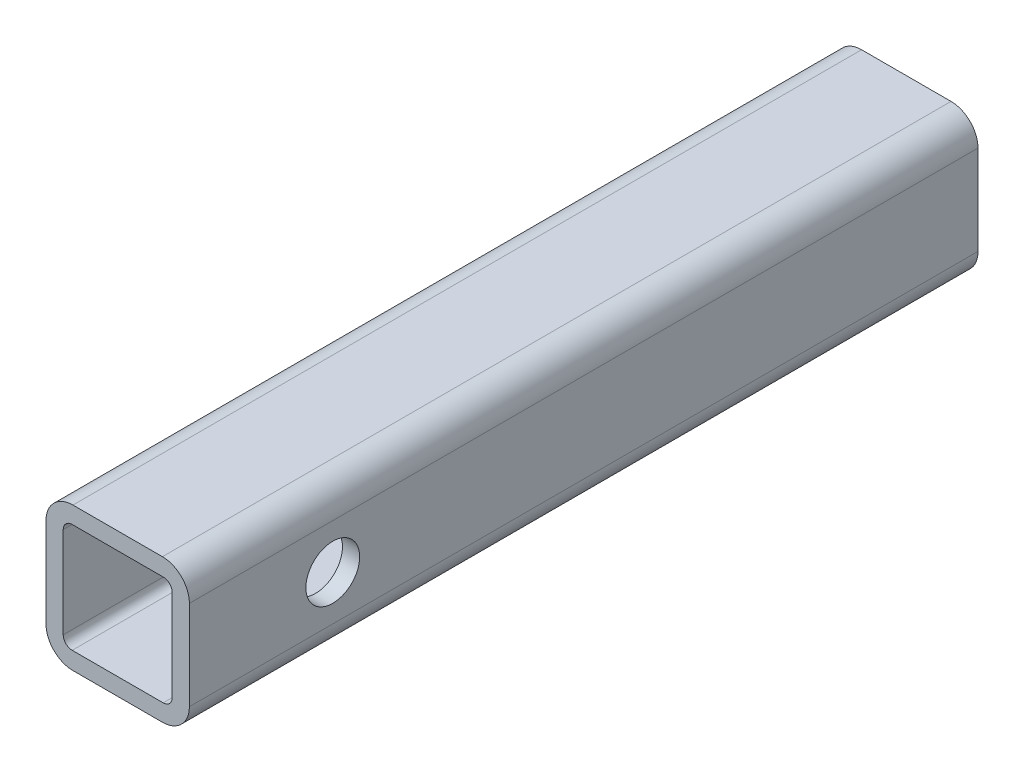
ISO-10303-21;
HEADER;
FILE_DESCRIPTION(('STEP AP214'),'2;1');
FILE_NAME('part.step','',(''),(''),'','','');
FILE_SCHEMA(('AUTOMOTIVE_DESIGN { 1 0 10303 214 1 1 1 1 }'));
ENDSEC;
DATA;
#1=APPLICATION_CONTEXT('core data for automotive mechanical design processes');
#2=APPLICATION_PROTOCOL_DEFINITION('international standard','automotive_design',2000,#1);
#3=PRODUCT_CONTEXT('',#1,'mechanical');
#4=PRODUCT('Part','Part','',(#3));
#5=PRODUCT_RELATED_PRODUCT_CATEGORY('part','',(#4));
#6=PRODUCT_DEFINITION_FORMATION('','',#4);
#7=PRODUCT_DEFINITION_CONTEXT('part definition',#1,'design');
#8=PRODUCT_DEFINITION('design','',#6,#7);
#9=PRODUCT_DEFINITION_SHAPE('','',#8);
#10=(LENGTH_UNIT() NAMED_UNIT(*) SI_UNIT(.MILLI.,.METRE.));
#11=(NAMED_UNIT(*) PLANE_ANGLE_UNIT() SI_UNIT($,.RADIAN.));
#12=(NAMED_UNIT(*) SI_UNIT($,.STERADIAN.) SOLID_ANGLE_UNIT());
#13=UNCERTAINTY_MEASURE_WITH_UNIT(LENGTH_MEASURE(1.E-05),#10,'distance_accuracy_value','');
#14=(GEOMETRIC_REPRESENTATION_CONTEXT(3) GLOBAL_UNCERTAINTY_ASSIGNED_CONTEXT((#13)) GLOBAL_UNIT_ASSIGNED_CONTEXT((#10,
#11,#12)) REPRESENTATION_CONTEXT('',''));
#15=CARTESIAN_POINT('',(0.,0.,0.));
#16=DIRECTION('',(0.,0.,1.));
#17=DIRECTION('',(1.,0.,0.));
#18=AXIS2_PLACEMENT_3D('',#15,#16,#17);
#19=CARTESIAN_POINT('',(25.4,12.7,114.3));
#20=DIRECTION('',(1.,0.,0.));
#21=DIRECTION('',(0.,0.,-1.));
#22=AXIS2_PLACEMENT_3D('',#19,#20,#21);
#23=CYLINDRICAL_SURFACE('',#22,4.7625);
#24=CARTESIAN_POINT('',(3.048,12.7,114.3));
#25=DIRECTION('',(1.,0.,0.));
#26=DIRECTION('',(0.,0.,-1.));
#27=AXIS2_PLACEMENT_3D('',#24,#25,#26);
#28=CIRCLE('',#27,4.7625);
#29=CARTESIAN_POINT('',(3.048,12.7,109.5375));
#30=VERTEX_POINT('',#29);
#31=EDGE_CURVE('E177',#30,#30,#28,.F.);
#32=ORIENTED_EDGE('',*,*,#31,.F.);
#33=EDGE_LOOP('',(#32));
#34=FACE_BOUND('',#33,.T.);
#35=CARTESIAN_POINT('',(0.,12.7,114.3));
#36=DIRECTION('',(1.,0.,0.));
#37=DIRECTION('',(0.,0.,-1.));
#38=AXIS2_PLACEMENT_3D('',#35,#36,#37);
#39=CIRCLE('',#38,4.7625);
#40=CARTESIAN_POINT('',(0.,12.7,109.5375));
#41=VERTEX_POINT('',#40);
#42=EDGE_CURVE('E19',#41,#41,#39,.T.);
#43=ORIENTED_EDGE('',*,*,#42,.F.);
#44=EDGE_LOOP('',(#43));
#45=FACE_BOUND('',#44,.T.);
#46=ADVANCED_FACE('F16',(#34,#45),#23,.F.);
#47=CARTESIAN_POINT('',(25.4,12.7,114.3));
#48=DIRECTION('',(1.,0.,0.));
#49=DIRECTION('',(0.,0.,-1.));
#50=AXIS2_PLACEMENT_3D('',#47,#48,#49);
#51=CYLINDRICAL_SURFACE('',#50,4.7625);
#52=CARTESIAN_POINT('',(22.352,12.7,114.3));
#53=DIRECTION('',(1.,0.,0.));
#54=DIRECTION('',(0.,0.,-1.));
#55=AXIS2_PLACEMENT_3D('',#52,#53,#54);
#56=CIRCLE('',#55,4.7625);
#57=CARTESIAN_POINT('',(22.352,12.7,109.5375));
#58=VERTEX_POINT('',#57);
#59=EDGE_CURVE('E167',#58,#58,#56,.T.);
#60=ORIENTED_EDGE('',*,*,#59,.F.);
#61=EDGE_LOOP('',(#60));
#62=FACE_BOUND('',#61,.T.);
#63=CARTESIAN_POINT('',(25.4,12.7,114.3));
#64=DIRECTION('',(1.,0.,0.));
#65=DIRECTION('',(0.,0.,-1.));
#66=AXIS2_PLACEMENT_3D('',#63,#64,#65);
#67=CIRCLE('',#66,4.7625);
#68=CARTESIAN_POINT('',(25.4,12.7,109.5375));
#69=VERTEX_POINT('',#68);
#70=EDGE_CURVE('E184',#69,#69,#67,.F.);
#71=ORIENTED_EDGE('',*,*,#70,.F.);
#72=EDGE_LOOP('',(#71));
#73=FACE_BOUND('',#72,.T.);
#74=ADVANCED_FACE('F245',(#62,#73),#51,.F.);
#75=CARTESIAN_POINT('',(4.7752,20.6248,321.81292));
#76=DIRECTION('',(0.,0.,-1.));
#77=DIRECTION('',(-1.,0.,0.));
#78=AXIS2_PLACEMENT_3D('',#75,#76,#77);
#79=CYLINDRICAL_SURFACE('',#78,4.7752);
#80=CARTESIAN_POINT('',(4.7752,20.6248,139.7));
#81=DIRECTION('',(0.,0.,-1.));
#82=DIRECTION('',(-1.,0.,0.));
#83=AXIS2_PLACEMENT_3D('',#80,#81,#82);
#84=CIRCLE('',#83,4.7752);
#85=CARTESIAN_POINT('',(4.7752,25.4,139.7));
#86=VERTEX_POINT('',#85);
#87=CARTESIAN_POINT('',(0.,20.6248,139.7));
#88=VERTEX_POINT('',#87);
#89=EDGE_CURVE('E171',#86,#88,#84,.F.);
#90=ORIENTED_EDGE('',*,*,#89,.F.);
#91=DIRECTION('',(0.,0.,1.));
#92=VECTOR('',#91,1.);
#93=CARTESIAN_POINT('',(4.7752,25.4,0.));
#94=LINE('',#93,#92);
#95=CARTESIAN_POINT('',(4.7752,25.4,0.));
#96=VERTEX_POINT('',#95);
#97=EDGE_CURVE('E178',#96,#86,#94,.T.);
#98=ORIENTED_EDGE('',*,*,#97,.F.);
#99=CARTESIAN_POINT('',(4.7752,20.6248,0.));
#100=DIRECTION('',(0.,0.,-1.));
#101=DIRECTION('',(-1.,0.,0.));
#102=AXIS2_PLACEMENT_3D('',#99,#100,#101);
#103=CIRCLE('',#102,4.7752);
#104=CARTESIAN_POINT('',(0.,20.6248,0.));
#105=VERTEX_POINT('',#104);
#106=EDGE_CURVE('E230',#96,#105,#103,.F.);
#107=ORIENTED_EDGE('',*,*,#106,.T.);
#108=DIRECTION('',(0.,0.,1.));
#109=VECTOR('',#108,1.);
#110=CARTESIAN_POINT('',(0.,20.6248,0.));
#111=LINE('',#110,#109);
#112=EDGE_CURVE('E190',#88,#105,#111,.F.);
#113=ORIENTED_EDGE('',*,*,#112,.F.);
#114=EDGE_LOOP('',(#90,#98,#107,#113));
#115=FACE_BOUND('',#114,.T.);
#116=ADVANCED_FACE('F247',(#115),#79,.T.);
#117=CARTESIAN_POINT('',(0.,25.4,0.));
#118=DIRECTION('',(-1.,0.,0.));
#119=DIRECTION('',(0.,0.,1.));
#120=AXIS2_PLACEMENT_3D('',#117,#118,#119);
#121=PLANE('',#120);
#122=ORIENTED_EDGE('',*,*,#42,.T.);
#123=EDGE_LOOP('',(#122));
#124=FACE_BOUND('',#123,.T.);
#125=DIRECTION('',(0.,0.,-1.));
#126=VECTOR('',#125,1.);
#127=CARTESIAN_POINT('',(0.,4.7752,321.81292));
#128=LINE('',#127,#126);
#129=CARTESIAN_POINT('',(0.,4.7752,139.7));
#130=VERTEX_POINT('',#129);
#131=CARTESIAN_POINT('',(0.,4.7752,0.));
#132=VERTEX_POINT('',#131);
#133=EDGE_CURVE('E130',#130,#132,#128,.T.);
#134=ORIENTED_EDGE('',*,*,#133,.F.);
#135=DIRECTION('',(0.,1.,0.));
#136=VECTOR('',#135,1.);
#137=CARTESIAN_POINT('',(0.,0.,139.7));
#138=LINE('',#137,#136);
#139=EDGE_CURVE('E216',#88,#130,#138,.F.);
#140=ORIENTED_EDGE('',*,*,#139,.F.);
#141=ORIENTED_EDGE('',*,*,#112,.T.);
#142=DIRECTION('',(0.,1.,0.));
#143=VECTOR('',#142,1.);
#144=CARTESIAN_POINT('',(0.,0.,0.));
#145=LINE('',#144,#143);
#146=EDGE_CURVE('E119',#105,#132,#145,.F.);
#147=ORIENTED_EDGE('',*,*,#146,.T.);
#148=EDGE_LOOP('',(#134,#140,#141,#147));
#149=FACE_BOUND('',#148,.T.);
#150=ADVANCED_FACE('F254',(#124,#149),#121,.T.);
#151=CARTESIAN_POINT('',(4.7752,4.7752,321.81292));
#152=DIRECTION('',(0.,0.,-1.));
#153=DIRECTION('',(-1.,0.,0.));
#154=AXIS2_PLACEMENT_3D('',#151,#152,#153);
#155=CYLINDRICAL_SURFACE('',#154,4.7752);
#156=CARTESIAN_POINT('',(4.7752,4.7752,139.7));
#157=DIRECTION('',(0.,0.,-1.));
#158=DIRECTION('',(-1.,0.,0.));
#159=AXIS2_PLACEMENT_3D('',#156,#157,#158);
#160=CIRCLE('',#159,4.7752);
#161=CARTESIAN_POINT('',(4.7752,0.,139.7));
#162=VERTEX_POINT('',#161);
#163=EDGE_CURVE('E214',#130,#162,#160,.F.);
#164=ORIENTED_EDGE('',*,*,#163,.F.);
#165=ORIENTED_EDGE('',*,*,#133,.T.);
#166=CARTESIAN_POINT('',(4.7752,4.7752,0.));
#167=DIRECTION('',(0.,0.,-1.));
#168=DIRECTION('',(-1.,0.,0.));
#169=AXIS2_PLACEMENT_3D('',#166,#167,#168);
#170=CIRCLE('',#169,4.7752);
#171=CARTESIAN_POINT('',(4.7752,0.,0.));
#172=VERTEX_POINT('',#171);
#173=EDGE_CURVE('E124',#132,#172,#170,.F.);
#174=ORIENTED_EDGE('',*,*,#173,.T.);
#175=DIRECTION('',(0.,0.,-1.));
#176=VECTOR('',#175,1.);
#177=CARTESIAN_POINT('',(4.7752,0.,0.));
#178=LINE('',#177,#176);
#179=EDGE_CURVE('E128',#162,#172,#178,.T.);
#180=ORIENTED_EDGE('',*,*,#179,.F.);
#181=EDGE_LOOP('',(#164,#165,#174,#180));
#182=FACE_BOUND('',#181,.T.);
#183=ADVANCED_FACE('F127',(#182),#155,.T.);
#184=CARTESIAN_POINT('',(0.,0.,0.));
#185=DIRECTION('',(0.,-1.,0.));
#186=DIRECTION('',(0.,0.,-1.));
#187=AXIS2_PLACEMENT_3D('',#184,#185,#186);
#188=PLANE('',#187);
#189=DIRECTION('',(0.,0.,-1.));
#190=VECTOR('',#189,1.);
#191=CARTESIAN_POINT('',(20.6248,0.,321.81292));
#192=LINE('',#191,#190);
#193=CARTESIAN_POINT('',(20.6248,0.,139.7));
#194=VERTEX_POINT('',#193);
#195=CARTESIAN_POINT('',(20.6248,0.,0.));
#196=VERTEX_POINT('',#195);
#197=EDGE_CURVE('E141',#194,#196,#192,.T.);
#198=ORIENTED_EDGE('',*,*,#197,.F.);
#199=DIRECTION('',(1.,0.,0.));
#200=VECTOR('',#199,1.);
#201=CARTESIAN_POINT('',(0.,0.,139.7));
#202=LINE('',#201,#200);
#203=EDGE_CURVE('E139',#162,#194,#202,.T.);
#204=ORIENTED_EDGE('',*,*,#203,.F.);
#205=ORIENTED_EDGE('',*,*,#179,.T.);
#206=DIRECTION('',(1.,0.,0.));
#207=VECTOR('',#206,1.);
#208=CARTESIAN_POINT('',(0.,0.,0.));
#209=LINE('',#208,#207);
#210=EDGE_CURVE('E133',#172,#196,#209,.T.);
#211=ORIENTED_EDGE('',*,*,#210,.T.);
#212=EDGE_LOOP('',(#198,#204,#205,#211));
#213=FACE_BOUND('',#212,.T.);
#214=ADVANCED_FACE('F136',(#213),#188,.T.);
#215=CARTESIAN_POINT('',(20.6248,4.7752,321.81292));
#216=DIRECTION('',(0.,0.,-1.));
#217=DIRECTION('',(-1.,0.,0.));
#218=AXIS2_PLACEMENT_3D('',#215,#216,#217);
#219=CYLINDRICAL_SURFACE('',#218,4.7752);
#220=CARTESIAN_POINT('',(20.6248,4.7752,139.7));
#221=DIRECTION('',(0.,0.,-1.));
#222=DIRECTION('',(-1.,0.,0.));
#223=AXIS2_PLACEMENT_3D('',#220,#221,#222);
#224=CIRCLE('',#223,4.7752);
#225=CARTESIAN_POINT('',(25.4,4.7752,139.7));
#226=VERTEX_POINT('',#225);
#227=EDGE_CURVE('E211',#194,#226,#224,.F.);
#228=ORIENTED_EDGE('',*,*,#227,.F.);
#229=ORIENTED_EDGE('',*,*,#197,.T.);
#230=CARTESIAN_POINT('',(20.6248,4.7752,0.));
#231=DIRECTION('',(0.,0.,-1.));
#232=DIRECTION('',(-1.,0.,0.));
#233=AXIS2_PLACEMENT_3D('',#230,#231,#232);
#234=CIRCLE('',#233,4.7752);
#235=CARTESIAN_POINT('',(25.4,4.7752,0.));
#236=VERTEX_POINT('',#235);
#237=EDGE_CURVE('E147',#196,#236,#234,.F.);
#238=ORIENTED_EDGE('',*,*,#237,.T.);
#239=DIRECTION('',(0.,0.,-1.));
#240=VECTOR('',#239,1.);
#241=CARTESIAN_POINT('',(25.4,4.7752,0.));
#242=LINE('',#241,#240);
#243=EDGE_CURVE('E185',#226,#236,#242,.T.);
#244=ORIENTED_EDGE('',*,*,#243,.F.);
#245=EDGE_LOOP('',(#228,#229,#238,#244));
#246=FACE_BOUND('',#245,.T.);
#247=ADVANCED_FACE('F311',(#246),#219,.T.);
#248=CARTESIAN_POINT('',(25.4,0.,0.));
#249=DIRECTION('',(1.,0.,0.));
#250=DIRECTION('',(0.,0.,-1.));
#251=AXIS2_PLACEMENT_3D('',#248,#249,#250);
#252=PLANE('',#251);
#253=ORIENTED_EDGE('',*,*,#70,.T.);
#254=EDGE_LOOP('',(#253));
#255=FACE_BOUND('',#254,.T.);
#256=DIRECTION('',(0.,0.,-1.));
#257=VECTOR('',#256,1.);
#258=CARTESIAN_POINT('',(25.4,20.6248,321.81292));
#259=LINE('',#258,#257);
#260=CARTESIAN_POINT('',(25.4,20.6248,139.7));
#261=VERTEX_POINT('',#260);
#262=CARTESIAN_POINT('',(25.4,20.6248,0.));
#263=VERTEX_POINT('',#262);
#264=EDGE_CURVE('E181',#261,#263,#259,.T.);
#265=ORIENTED_EDGE('',*,*,#264,.F.);
#266=DIRECTION('',(0.,1.,0.));
#267=VECTOR('',#266,1.);
#268=CARTESIAN_POINT('',(25.4,0.,139.7));
#269=LINE('',#268,#267);
#270=EDGE_CURVE('E210',#226,#261,#269,.T.);
#271=ORIENTED_EDGE('',*,*,#270,.F.);
#272=ORIENTED_EDGE('',*,*,#243,.T.);
#273=DIRECTION('',(0.,1.,0.));
#274=VECTOR('',#273,1.);
#275=CARTESIAN_POINT('',(25.4,0.,0.));
#276=LINE('',#275,#274);
#277=EDGE_CURVE('E149',#236,#263,#276,.T.);
#278=ORIENTED_EDGE('',*,*,#277,.T.);
#279=EDGE_LOOP('',(#265,#271,#272,#278));
#280=FACE_BOUND('',#279,.T.);
#281=ADVANCED_FACE('F242',(#255,#280),#252,.T.);
#282=CARTESIAN_POINT('',(20.6248,20.6248,321.81292));
#283=DIRECTION('',(0.,0.,-1.));
#284=DIRECTION('',(-1.,0.,0.));
#285=AXIS2_PLACEMENT_3D('',#282,#283,#284);
#286=CYLINDRICAL_SURFACE('',#285,4.7752);
#287=CARTESIAN_POINT('',(20.6248,20.6248,139.7));
#288=DIRECTION('',(0.,0.,-1.));
#289=DIRECTION('',(-1.,0.,0.));
#290=AXIS2_PLACEMENT_3D('',#287,#288,#289);
#291=CIRCLE('',#290,4.7752);
#292=CARTESIAN_POINT('',(20.6248,25.4,139.7));
#293=VERTEX_POINT('',#292);
#294=EDGE_CURVE('E206',#261,#293,#291,.F.);
#295=ORIENTED_EDGE('',*,*,#294,.F.);
#296=ORIENTED_EDGE('',*,*,#264,.T.);
#297=CARTESIAN_POINT('',(20.6248,20.6248,0.));
#298=DIRECTION('',(0.,0.,-1.));
#299=DIRECTION('',(-1.,0.,0.));
#300=AXIS2_PLACEMENT_3D('',#297,#298,#299);
#301=CIRCLE('',#300,4.7752);
#302=CARTESIAN_POINT('',(20.6248,25.4,0.));
#303=VERTEX_POINT('',#302);
#304=EDGE_CURVE('E234',#263,#303,#301,.F.);
#305=ORIENTED_EDGE('',*,*,#304,.T.);
#306=DIRECTION('',(0.,0.,1.));
#307=VECTOR('',#306,1.);
#308=CARTESIAN_POINT('',(20.6248,25.4,0.));
#309=LINE('',#308,#307);
#310=EDGE_CURVE('E174',#293,#303,#309,.F.);
#311=ORIENTED_EDGE('',*,*,#310,.F.);
#312=EDGE_LOOP('',(#295,#296,#305,#311));
#313=FACE_BOUND('',#312,.T.);
#314=ADVANCED_FACE('F304',(#313),#286,.T.);
#315=CARTESIAN_POINT('',(25.4,25.4,0.));
#316=DIRECTION('',(0.,1.,0.));
#317=DIRECTION('',(0.,0.,1.));
#318=AXIS2_PLACEMENT_3D('',#315,#316,#317);
#319=PLANE('',#318);
#320=ORIENTED_EDGE('',*,*,#310,.T.);
#321=DIRECTION('',(1.,0.,0.));
#322=VECTOR('',#321,1.);
#323=CARTESIAN_POINT('',(0.,25.4,0.));
#324=LINE('',#323,#322);
#325=EDGE_CURVE('E233',#303,#96,#324,.F.);
#326=ORIENTED_EDGE('',*,*,#325,.T.);
#327=ORIENTED_EDGE('',*,*,#97,.T.);
#328=DIRECTION('',(1.,0.,0.));
#329=VECTOR('',#328,1.);
#330=CARTESIAN_POINT('',(0.,25.4,139.7));
#331=LINE('',#330,#329);
#332=EDGE_CURVE('E209',#293,#86,#331,.F.);
#333=ORIENTED_EDGE('',*,*,#332,.F.);
#334=EDGE_LOOP('',(#320,#326,#327,#333));
#335=FACE_BOUND('',#334,.T.);
#336=ADVANCED_FACE('F300',(#335),#319,.T.);
#337=CARTESIAN_POINT('',(3.048,3.048,0.));
#338=DIRECTION('',(1.,0.,0.));
#339=DIRECTION('',(0.,0.,-1.));
#340=AXIS2_PLACEMENT_3D('',#337,#338,#339);
#341=PLANE('',#340);
#342=ORIENTED_EDGE('',*,*,#31,.T.);
#343=EDGE_LOOP('',(#342));
#344=FACE_BOUND('',#343,.T.);
#345=DIRECTION('',(0.,0.,1.));
#346=VECTOR('',#345,1.);
#347=CARTESIAN_POINT('',(3.048,4.6355,-182.11292));
#348=LINE('',#347,#346);
#349=CARTESIAN_POINT('',(3.048,4.6355,139.7));
#350=VERTEX_POINT('',#349);
#351=CARTESIAN_POINT('',(3.048,4.6355,0.));
#352=VERTEX_POINT('',#351);
#353=EDGE_CURVE('E159',#350,#352,#348,.F.);
#354=ORIENTED_EDGE('',*,*,#353,.T.);
#355=DIRECTION('',(0.,1.,0.));
#356=VECTOR('',#355,1.);
#357=CARTESIAN_POINT('',(3.048,0.,0.));
#358=LINE('',#357,#356);
#359=CARTESIAN_POINT('',(3.048,20.7645,0.));
#360=VERTEX_POINT('',#359);
#361=EDGE_CURVE('E226',#352,#360,#358,.T.);
#362=ORIENTED_EDGE('',*,*,#361,.T.);
#363=DIRECTION('',(0.,0.,1.));
#364=VECTOR('',#363,1.);
#365=CARTESIAN_POINT('',(3.048,20.7645,-182.11292));
#366=LINE('',#365,#364);
#367=CARTESIAN_POINT('',(3.048,20.7645,139.7));
#368=VERTEX_POINT('',#367);
#369=EDGE_CURVE('E155',#360,#368,#366,.T.);
#370=ORIENTED_EDGE('',*,*,#369,.T.);
#371=DIRECTION('',(0.,1.,0.));
#372=VECTOR('',#371,1.);
#373=CARTESIAN_POINT('',(3.048,0.,139.7));
#374=LINE('',#373,#372);
#375=EDGE_CURVE('E205',#350,#368,#374,.T.);
#376=ORIENTED_EDGE('',*,*,#375,.F.);
#377=EDGE_LOOP('',(#354,#362,#370,#376));
#378=FACE_BOUND('',#377,.T.);
#379=ADVANCED_FACE('F296',(#344,#378),#341,.T.);
#380=CARTESIAN_POINT('',(22.352,22.352,0.));
#381=DIRECTION('',(-1.,0.,0.));
#382=DIRECTION('',(0.,0.,1.));
#383=AXIS2_PLACEMENT_3D('',#380,#381,#382);
#384=PLANE('',#383);
#385=ORIENTED_EDGE('',*,*,#59,.T.);
#386=EDGE_LOOP('',(#385));
#387=FACE_BOUND('',#386,.T.);
#388=DIRECTION('',(0.,0.,1.));
#389=VECTOR('',#388,1.);
#390=CARTESIAN_POINT('',(22.352,4.6355,-182.11292));
#391=LINE('',#390,#389);
#392=CARTESIAN_POINT('',(22.352,4.6355,0.));
#393=VERTEX_POINT('',#392);
#394=CARTESIAN_POINT('',(22.352,4.6355,139.7));
#395=VERTEX_POINT('',#394);
#396=EDGE_CURVE('E164',#393,#395,#391,.T.);
#397=ORIENTED_EDGE('',*,*,#396,.T.);
#398=DIRECTION('',(0.,1.,0.));
#399=VECTOR('',#398,1.);
#400=CARTESIAN_POINT('',(22.352,0.,139.7));
#401=LINE('',#400,#399);
#402=CARTESIAN_POINT('',(22.352,20.7645,139.7));
#403=VERTEX_POINT('',#402);
#404=EDGE_CURVE('E200',#403,#395,#401,.F.);
#405=ORIENTED_EDGE('',*,*,#404,.F.);
#406=DIRECTION('',(0.,0.,1.));
#407=VECTOR('',#406,1.);
#408=CARTESIAN_POINT('',(22.352,20.7645,-182.11292));
#409=LINE('',#408,#407);
#410=CARTESIAN_POINT('',(22.352,20.7645,0.));
#411=VERTEX_POINT('',#410);
#412=EDGE_CURVE('E168',#403,#411,#409,.F.);
#413=ORIENTED_EDGE('',*,*,#412,.T.);
#414=DIRECTION('',(0.,1.,0.));
#415=VECTOR('',#414,1.);
#416=CARTESIAN_POINT('',(22.352,0.,0.));
#417=LINE('',#416,#415);
#418=EDGE_CURVE('E223',#411,#393,#417,.F.);
#419=ORIENTED_EDGE('',*,*,#418,.T.);
#420=EDGE_LOOP('',(#397,#405,#413,#419));
#421=FACE_BOUND('',#420,.T.);
#422=ADVANCED_FACE('F292',(#387,#421),#384,.T.);
#423=CARTESIAN_POINT('',(20.7645,4.6355,-182.11292));
#424=DIRECTION('',(0.,0.,1.));
#425=DIRECTION('',(1.,0.,0.));
#426=AXIS2_PLACEMENT_3D('',#423,#424,#425);
#427=CYLINDRICAL_SURFACE('',#426,1.5875);
#428=CARTESIAN_POINT('',(20.7645,4.6355,139.7));
#429=DIRECTION('',(0.,0.,1.));
#430=DIRECTION('',(1.,0.,0.));
#431=AXIS2_PLACEMENT_3D('',#428,#429,#430);
#432=CIRCLE('',#431,1.5875);
#433=CARTESIAN_POINT('',(20.7645,3.048,139.7));
#434=VERTEX_POINT('',#433);
#435=EDGE_CURVE('E197',#395,#434,#432,.F.);
#436=ORIENTED_EDGE('',*,*,#435,.F.);
#437=ORIENTED_EDGE('',*,*,#396,.F.);
#438=CARTESIAN_POINT('',(20.7645,4.6355,0.));
#439=DIRECTION('',(0.,0.,1.));
#440=DIRECTION('',(1.,0.,0.));
#441=AXIS2_PLACEMENT_3D('',#438,#439,#440);
#442=CIRCLE('',#441,1.5875);
#443=CARTESIAN_POINT('',(20.7645,3.048,0.));
#444=VERTEX_POINT('',#443);
#445=EDGE_CURVE('E221',#393,#444,#442,.F.);
#446=ORIENTED_EDGE('',*,*,#445,.T.);
#447=DIRECTION('',(0.,0.,1.));
#448=VECTOR('',#447,1.);
#449=CARTESIAN_POINT('',(20.7645,3.048,0.));
#450=LINE('',#449,#448);
#451=EDGE_CURVE('E160',#434,#444,#450,.F.);
#452=ORIENTED_EDGE('',*,*,#451,.F.);
#453=EDGE_LOOP('',(#436,#437,#446,#452));
#454=FACE_BOUND('',#453,.T.);
#455=ADVANCED_FACE('F288',(#454),#427,.F.);
#456=CARTESIAN_POINT('',(22.352,3.048,0.));
#457=DIRECTION('',(0.,1.,0.));
#458=DIRECTION('',(0.,0.,1.));
#459=AXIS2_PLACEMENT_3D('',#456,#457,#458);
#460=PLANE('',#459);
#461=ORIENTED_EDGE('',*,*,#451,.T.);
#462=DIRECTION('',(1.,0.,0.));
#463=VECTOR('',#462,1.);
#464=CARTESIAN_POINT('',(0.,3.048,0.));
#465=LINE('',#464,#463);
#466=CARTESIAN_POINT('',(4.6355,3.048,0.));
#467=VERTEX_POINT('',#466);
#468=EDGE_CURVE('E220',#444,#467,#465,.F.);
#469=ORIENTED_EDGE('',*,*,#468,.T.);
#470=DIRECTION('',(0.,0.,1.));
#471=VECTOR('',#470,1.);
#472=CARTESIAN_POINT('',(4.6355,3.048,-182.11292));
#473=LINE('',#472,#471);
#474=CARTESIAN_POINT('',(4.6355,3.048,139.7));
#475=VERTEX_POINT('',#474);
#476=EDGE_CURVE('E156',#467,#475,#473,.T.);
#477=ORIENTED_EDGE('',*,*,#476,.T.);
#478=DIRECTION('',(1.,0.,0.));
#479=VECTOR('',#478,1.);
#480=CARTESIAN_POINT('',(0.,3.048,139.7));
#481=LINE('',#480,#479);
#482=EDGE_CURVE('E196',#434,#475,#481,.F.);
#483=ORIENTED_EDGE('',*,*,#482,.F.);
#484=EDGE_LOOP('',(#461,#469,#477,#483));
#485=FACE_BOUND('',#484,.T.);
#486=ADVANCED_FACE('F284',(#485),#460,.T.);
#487=CARTESIAN_POINT('',(4.6355,4.6355,-182.11292));
#488=DIRECTION('',(0.,0.,1.));
#489=DIRECTION('',(1.,0.,0.));
#490=AXIS2_PLACEMENT_3D('',#487,#488,#489);
#491=CYLINDRICAL_SURFACE('',#490,1.5875);
#492=CARTESIAN_POINT('',(4.6355,4.6355,139.7));
#493=DIRECTION('',(0.,0.,1.));
#494=DIRECTION('',(1.,0.,0.));
#495=AXIS2_PLACEMENT_3D('',#492,#493,#494);
#496=CIRCLE('',#495,1.5875);
#497=EDGE_CURVE('E192',#475,#350,#496,.F.);
#498=ORIENTED_EDGE('',*,*,#497,.F.);
#499=ORIENTED_EDGE('',*,*,#476,.F.);
#500=CARTESIAN_POINT('',(4.6355,4.6355,0.));
#501=DIRECTION('',(0.,0.,1.));
#502=DIRECTION('',(1.,0.,0.));
#503=AXIS2_PLACEMENT_3D('',#500,#501,#502);
#504=CIRCLE('',#503,1.5875);
#505=EDGE_CURVE('E227',#467,#352,#504,.F.);
#506=ORIENTED_EDGE('',*,*,#505,.T.);
#507=ORIENTED_EDGE('',*,*,#353,.F.);
#508=EDGE_LOOP('',(#498,#499,#506,#507));
#509=FACE_BOUND('',#508,.T.);
#510=ADVANCED_FACE('F280',(#509),#491,.F.);
#511=CARTESIAN_POINT('',(4.6355,20.7645,-182.11292));
#512=DIRECTION('',(0.,0.,1.));
#513=DIRECTION('',(1.,0.,0.));
#514=AXIS2_PLACEMENT_3D('',#511,#512,#513);
#515=CYLINDRICAL_SURFACE('',#514,1.5875);
#516=CARTESIAN_POINT('',(4.6355,20.7645,139.7));
#517=DIRECTION('',(0.,0.,1.));
#518=DIRECTION('',(1.,0.,0.));
#519=AXIS2_PLACEMENT_3D('',#516,#517,#518);
#520=CIRCLE('',#519,1.5875);
#521=CARTESIAN_POINT('',(4.6355,22.352,139.7));
#522=VERTEX_POINT('',#521);
#523=EDGE_CURVE('E202',#368,#522,#520,.F.);
#524=ORIENTED_EDGE('',*,*,#523,.F.);
#525=ORIENTED_EDGE('',*,*,#369,.F.);
#526=CARTESIAN_POINT('',(4.6355,20.7645,0.));
#527=DIRECTION('',(0.,0.,1.));
#528=DIRECTION('',(1.,0.,0.));
#529=AXIS2_PLACEMENT_3D('',#526,#527,#528);
#530=CIRCLE('',#529,1.5875);
#531=CARTESIAN_POINT('',(4.6355,22.352,0.));
#532=VERTEX_POINT('',#531);
#533=EDGE_CURVE('E224',#360,#532,#530,.F.);
#534=ORIENTED_EDGE('',*,*,#533,.T.);
#535=DIRECTION('',(0.,0.,-1.));
#536=VECTOR('',#535,1.);
#537=CARTESIAN_POINT('',(4.6355,22.352,0.));
#538=LINE('',#537,#536);
#539=EDGE_CURVE('E195',#522,#532,#538,.T.);
#540=ORIENTED_EDGE('',*,*,#539,.F.);
#541=EDGE_LOOP('',(#524,#525,#534,#540));
#542=FACE_BOUND('',#541,.T.);
#543=ADVANCED_FACE('F276',(#542),#515,.F.);
#544=CARTESIAN_POINT('',(0.,0.,0.));
#545=DIRECTION('',(0.,0.,1.));
#546=DIRECTION('',(1.,0.,0.));
#547=AXIS2_PLACEMENT_3D('',#544,#545,#546);
#548=PLANE('',#547);
#549=ORIENTED_EDGE('',*,*,#445,.F.);
#550=ORIENTED_EDGE('',*,*,#418,.F.);
#551=CARTESIAN_POINT('',(20.7645,20.7645,0.));
#552=DIRECTION('',(0.,0.,1.));
#553=DIRECTION('',(1.,0.,0.));
#554=AXIS2_PLACEMENT_3D('',#551,#552,#553);
#555=CIRCLE('',#554,1.5875);
#556=CARTESIAN_POINT('',(20.7645,22.352,0.));
#557=VERTEX_POINT('',#556);
#558=EDGE_CURVE('E172',#411,#557,#555,.T.);
#559=ORIENTED_EDGE('',*,*,#558,.T.);
#560=DIRECTION('',(1.,0.,0.));
#561=VECTOR('',#560,1.);
#562=CARTESIAN_POINT('',(3.048,22.352,0.));
#563=LINE('',#562,#561);
#564=EDGE_CURVE('E333',#532,#557,#563,.T.);
#565=ORIENTED_EDGE('',*,*,#564,.F.);
#566=ORIENTED_EDGE('',*,*,#533,.F.);
#567=ORIENTED_EDGE('',*,*,#361,.F.);
#568=ORIENTED_EDGE('',*,*,#505,.F.);
#569=ORIENTED_EDGE('',*,*,#468,.F.);
#570=EDGE_LOOP('',(#549,#550,#559,#565,#566,#567,#568,#569));
#571=FACE_BOUND('',#570,.T.);
#572=ORIENTED_EDGE('',*,*,#325,.F.);
#573=ORIENTED_EDGE('',*,*,#304,.F.);
#574=ORIENTED_EDGE('',*,*,#277,.F.);
#575=ORIENTED_EDGE('',*,*,#237,.F.);
#576=ORIENTED_EDGE('',*,*,#210,.F.);
#577=ORIENTED_EDGE('',*,*,#173,.F.);
#578=ORIENTED_EDGE('',*,*,#146,.F.);
#579=ORIENTED_EDGE('',*,*,#106,.F.);
#580=EDGE_LOOP('',(#572,#573,#574,#575,#576,#577,#578,#579));
#581=FACE_BOUND('',#580,.T.);
#582=ADVANCED_FACE('F145',(#571,#581),#548,.F.);
#583=CARTESIAN_POINT('',(20.7645,20.7645,-182.11292));
#584=DIRECTION('',(0.,0.,1.));
#585=DIRECTION('',(1.,0.,0.));
#586=AXIS2_PLACEMENT_3D('',#583,#584,#585);
#587=CYLINDRICAL_SURFACE('',#586,1.5875);
#588=CARTESIAN_POINT('',(20.7645,20.7645,139.7));
#589=DIRECTION('',(0.,0.,1.));
#590=DIRECTION('',(1.,0.,0.));
#591=AXIS2_PLACEMENT_3D('',#588,#589,#590);
#592=CIRCLE('',#591,1.5875);
#593=CARTESIAN_POINT('',(20.7645,22.352,139.7));
#594=VERTEX_POINT('',#593);
#595=EDGE_CURVE('E34',#594,#403,#592,.F.);
#596=ORIENTED_EDGE('',*,*,#595,.F.);
#597=DIRECTION('',(0.,0.,-1.));
#598=VECTOR('',#597,1.);
#599=CARTESIAN_POINT('',(20.7645,22.352,0.));
#600=LINE('',#599,#598);
#601=EDGE_CURVE('E25',#557,#594,#600,.F.);
#602=ORIENTED_EDGE('',*,*,#601,.F.);
#603=ORIENTED_EDGE('',*,*,#558,.F.);
#604=ORIENTED_EDGE('',*,*,#412,.F.);
#605=EDGE_LOOP('',(#596,#602,#603,#604));
#606=FACE_BOUND('',#605,.T.);
#607=ADVANCED_FACE('F267',(#606),#587,.F.);
#608=CARTESIAN_POINT('',(0.,0.,139.7));
#609=DIRECTION('',(0.,0.,1.));
#610=DIRECTION('',(1.,0.,0.));
#611=AXIS2_PLACEMENT_3D('',#608,#609,#610);
#612=PLANE('',#611);
#613=ORIENTED_EDGE('',*,*,#482,.T.);
#614=ORIENTED_EDGE('',*,*,#497,.T.);
#615=ORIENTED_EDGE('',*,*,#375,.T.);
#616=ORIENTED_EDGE('',*,*,#523,.T.);
#617=DIRECTION('',(1.,0.,0.));
#618=VECTOR('',#617,1.);
#619=CARTESIAN_POINT('',(3.048,22.352,139.7));
#620=LINE('',#619,#618);
#621=EDGE_CURVE('E11',#594,#522,#620,.F.);
#622=ORIENTED_EDGE('',*,*,#621,.F.);
#623=ORIENTED_EDGE('',*,*,#595,.T.);
#624=ORIENTED_EDGE('',*,*,#404,.T.);
#625=ORIENTED_EDGE('',*,*,#435,.T.);
#626=EDGE_LOOP('',(#613,#614,#615,#616,#622,#623,#624,#625));
#627=FACE_BOUND('',#626,.T.);
#628=ORIENTED_EDGE('',*,*,#294,.T.);
#629=ORIENTED_EDGE('',*,*,#332,.T.);
#630=ORIENTED_EDGE('',*,*,#89,.T.);
#631=ORIENTED_EDGE('',*,*,#139,.T.);
#632=ORIENTED_EDGE('',*,*,#163,.T.);
#633=ORIENTED_EDGE('',*,*,#203,.T.);
#634=ORIENTED_EDGE('',*,*,#227,.T.);
#635=ORIENTED_EDGE('',*,*,#270,.T.);
#636=EDGE_LOOP('',(#628,#629,#630,#631,#632,#633,#634,#635));
#637=FACE_BOUND('',#636,.T.);
#638=ADVANCED_FACE('F261',(#627,#637),#612,.T.);
#639=CARTESIAN_POINT('',(3.048,22.352,0.));
#640=DIRECTION('',(0.,-1.,0.));
#641=DIRECTION('',(0.,0.,-1.));
#642=AXIS2_PLACEMENT_3D('',#639,#640,#641);
#643=PLANE('',#642);
#644=ORIENTED_EDGE('',*,*,#601,.T.);
#645=ORIENTED_EDGE('',*,*,#621,.T.);
#646=ORIENTED_EDGE('',*,*,#539,.T.);
#647=ORIENTED_EDGE('',*,*,#564,.T.);
#648=EDGE_LOOP('',(#644,#645,#646,#647));
#649=FACE_BOUND('',#648,.T.);
#650=ADVANCED_FACE('F259',(#649),#643,.T.);
#651=CLOSED_SHELL('',(#46,#74,#116,#150,#183,#214,#247,#281,#314,#336,#379,#422,#455,#486,#510,
#543,#582,#607,#638,#650));
#652=MANIFOLD_SOLID_BREP('B1',#651);
#653=ADVANCED_BREP_SHAPE_REPRESENTATION('',(#18,#652),#14);
#654=SHAPE_DEFINITION_REPRESENTATION(#9,#653);
ENDSEC;
END-ISO-10303-21;
